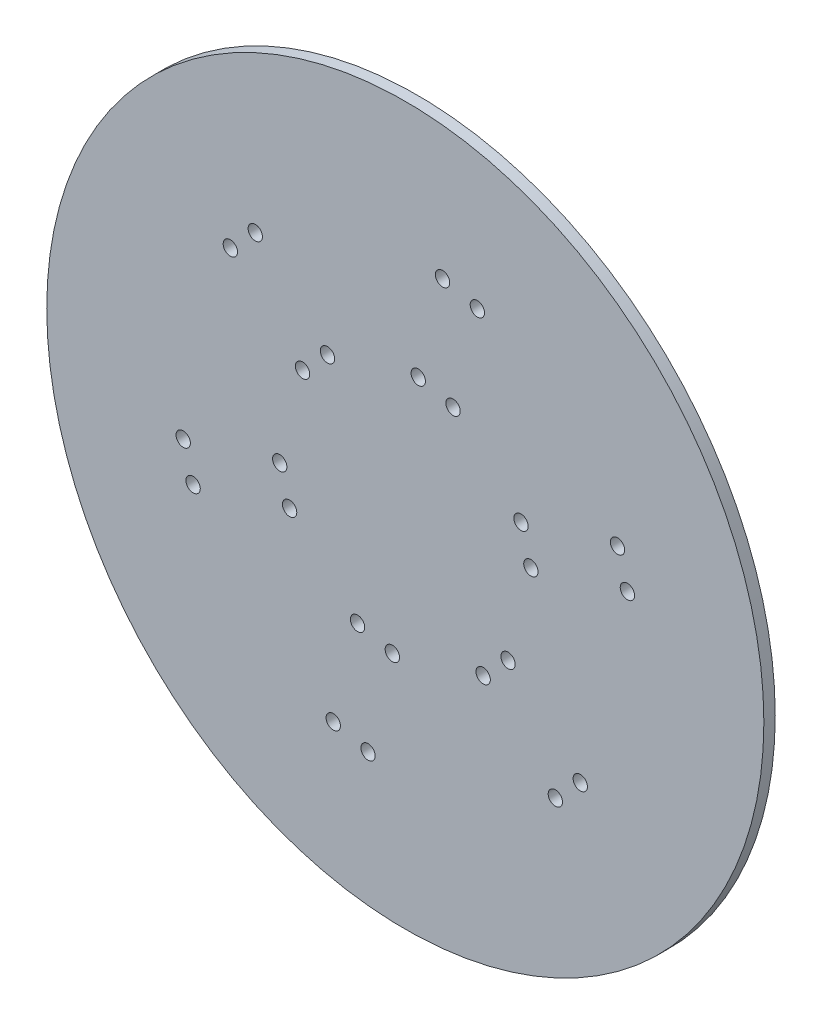
ISO-10303-21;
HEADER;
FILE_DESCRIPTION(('STEP AP214'),'2;1');
FILE_NAME('part.step','',(''),(''),'','','');
FILE_SCHEMA(('AUTOMOTIVE_DESIGN { 1 0 10303 214 1 1 1 1 }'));
ENDSEC;
DATA;
#1=APPLICATION_CONTEXT('core data for automotive mechanical design processes');
#2=APPLICATION_PROTOCOL_DEFINITION('international standard','automotive_design',2000,#1);
#3=PRODUCT_CONTEXT('',#1,'mechanical');
#4=PRODUCT('Part','Part','',(#3));
#5=PRODUCT_RELATED_PRODUCT_CATEGORY('part','',(#4));
#6=PRODUCT_DEFINITION_FORMATION('','',#4);
#7=PRODUCT_DEFINITION_CONTEXT('part definition',#1,'design');
#8=PRODUCT_DEFINITION('design','',#6,#7);
#9=PRODUCT_DEFINITION_SHAPE('','',#8);
#10=(LENGTH_UNIT() NAMED_UNIT(*) SI_UNIT(.MILLI.,.METRE.));
#11=(NAMED_UNIT(*) PLANE_ANGLE_UNIT() SI_UNIT($,.RADIAN.));
#12=(NAMED_UNIT(*) SI_UNIT($,.STERADIAN.) SOLID_ANGLE_UNIT());
#13=UNCERTAINTY_MEASURE_WITH_UNIT(LENGTH_MEASURE(1.E-05),#10,'distance_accuracy_value','');
#14=(GEOMETRIC_REPRESENTATION_CONTEXT(3) GLOBAL_UNCERTAINTY_ASSIGNED_CONTEXT((#13)) GLOBAL_UNIT_ASSIGNED_CONTEXT((#10,
#11,#12)) REPRESENTATION_CONTEXT('',''));
#15=CARTESIAN_POINT('',(0.,0.,0.));
#16=DIRECTION('',(0.,0.,1.));
#17=DIRECTION('',(1.,0.,0.));
#18=AXIS2_PLACEMENT_3D('',#15,#16,#17);
#19=CARTESIAN_POINT('',(0.,0.,3.175));
#20=DIRECTION('',(0.,0.,-1.));
#21=DIRECTION('',(-1.,0.,0.));
#22=AXIS2_PLACEMENT_3D('',#19,#20,#21);
#23=CYLINDRICAL_SURFACE('',#22,100.);
#24=CARTESIAN_POINT('',(0.,0.,3.175));
#25=DIRECTION('',(0.,0.,1.));
#26=DIRECTION('',(1.,0.,0.));
#27=AXIS2_PLACEMENT_3D('',#24,#25,#26);
#28=CIRCLE('',#27,100.);
#29=CARTESIAN_POINT('',(100.,0.,3.175));
#30=VERTEX_POINT('',#29);
#31=EDGE_CURVE('E10',#30,#30,#28,.T.);
#32=ORIENTED_EDGE('',*,*,#31,.F.);
#33=EDGE_LOOP('',(#32));
#34=FACE_BOUND('',#33,.T.);
#35=CARTESIAN_POINT('',(0.,0.,0.));
#36=DIRECTION('',(0.,0.,1.));
#37=DIRECTION('',(1.,0.,0.));
#38=AXIS2_PLACEMENT_3D('',#35,#36,#37);
#39=CIRCLE('',#38,100.);
#40=CARTESIAN_POINT('',(100.,0.,0.));
#41=VERTEX_POINT('',#40);
#42=EDGE_CURVE('E52',#41,#41,#39,.T.);
#43=ORIENTED_EDGE('',*,*,#42,.T.);
#44=EDGE_LOOP('',(#43));
#45=FACE_BOUND('',#44,.T.);
#46=ADVANCED_FACE('F49',(#34,#45),#23,.T.);
#47=CARTESIAN_POINT('',(0.,0.,3.175));
#48=DIRECTION('',(0.,0.,1.));
#49=DIRECTION('',(1.,0.,0.));
#50=AXIS2_PLACEMENT_3D('',#47,#48,#49);
#51=PLANE('',#50);
#52=CARTESIAN_POINT('',(-3.61521008648678,-35.1700192782212,3.175));
#53=DIRECTION('',(0.,0.,1.));
#54=DIRECTION('',(1.,0.,0.));
#55=AXIS2_PLACEMENT_3D('',#52,#53,#54);
#56=CIRCLE('',#55,2.);
#57=CARTESIAN_POINT('',(-1.61521008648678,-35.1700192782212,3.175));
#58=VERTEX_POINT('',#57);
#59=EDGE_CURVE('E135',#58,#58,#56,.T.);
#60=ORIENTED_EDGE('',*,*,#59,.F.);
#61=EDGE_LOOP('',(#60));
#62=FACE_BOUND('',#61,.T.);
#63=CARTESIAN_POINT('',(-59.1809359153441,-22.1724338804686,3.175));
#64=DIRECTION('',(0.,0.,1.));
#65=DIRECTION('',(1.,0.,0.));
#66=AXIS2_PLACEMENT_3D('',#63,#64,#65);
#67=CIRCLE('',#66,2.);
#68=CARTESIAN_POINT('',(-57.1809359153441,-22.1724338804686,3.175));
#69=VERTEX_POINT('',#68);
#70=EDGE_CURVE('E144',#69,#69,#67,.T.);
#71=ORIENTED_EDGE('',*,*,#70,.F.);
#72=EDGE_LOOP('',(#71));
#73=FACE_BOUND('',#72,.T.);
#74=CARTESIAN_POINT('',(-61.9374673497274,-12.5598621927642,3.175));
#75=DIRECTION('',(0.,0.,1.));
#76=DIRECTION('',(1.,0.,0.));
#77=AXIS2_PLACEMENT_3D('',#74,#75,#76);
#78=CIRCLE('',#77,2.);
#79=CARTESIAN_POINT('',(-59.9374673497274,-12.5598621927642,3.175));
#80=VERTEX_POINT('',#79);
#81=EDGE_CURVE('E152',#80,#80,#78,.T.);
#82=ORIENTED_EDGE('',*,*,#81,.F.);
#83=EDGE_LOOP('',(#82));
#84=FACE_BOUND('',#83,.T.);
#85=CARTESIAN_POINT('',(-32.2657351897717,-14.4541458641952,3.175));
#86=DIRECTION('',(0.,0.,1.));
#87=DIRECTION('',(1.,0.,0.));
#88=AXIS2_PLACEMENT_3D('',#85,#86,#87);
#89=CIRCLE('',#88,2.);
#90=CARTESIAN_POINT('',(-30.2657351897717,-14.4541458641952,3.175));
#91=VERTEX_POINT('',#90);
#92=EDGE_CURVE('E160',#91,#91,#89,.T.);
#93=ORIENTED_EDGE('',*,*,#92,.F.);
#94=EDGE_LOOP('',(#93));
#95=FACE_BOUND('',#94,.T.);
#96=CARTESIAN_POINT('',(-28.650525103285,20.7158734140257,3.175));
#97=DIRECTION('',(0.,0.,1.));
#98=DIRECTION('',(1.,0.,0.));
#99=AXIS2_PLACEMENT_3D('',#96,#97,#98);
#100=CIRCLE('',#99,2.);
#101=CARTESIAN_POINT('',(-26.650525103285,20.7158734140257,3.175));
#102=VERTEX_POINT('',#101);
#103=EDGE_CURVE('E178',#102,#102,#100,.T.);
#104=ORIENTED_EDGE('',*,*,#103,.F.);
#105=EDGE_LOOP('',(#104));
#106=FACE_BOUND('',#105,.T.);
#107=CARTESIAN_POINT('',(-41.8458934018298,47.3594890745504,3.175));
#108=DIRECTION('',(0.,0.,1.));
#109=DIRECTION('',(1.,0.,0.));
#110=AXIS2_PLACEMENT_3D('',#107,#108,#109);
#111=CIRCLE('',#110,2.);
#112=CARTESIAN_POINT('',(-39.8458934018298,47.3594890745504,3.175));
#113=VERTEX_POINT('',#112);
#114=EDGE_CURVE('E169',#113,#113,#111,.T.);
#115=ORIENTED_EDGE('',*,*,#114,.F.);
#116=EDGE_LOOP('',(#115));
#117=FACE_BOUND('',#116,.T.);
#118=CARTESIAN_POINT('',(-48.7923589618892,40.1659769821918,3.175));
#119=DIRECTION('',(0.,0.,1.));
#120=DIRECTION('',(1.,0.,0.));
#121=AXIS2_PLACEMENT_3D('',#118,#119,#120);
#122=CIRCLE('',#121,2.);
#123=CARTESIAN_POINT('',(-46.7923589618892,40.1659769821918,3.175));
#124=VERTEX_POINT('',#123);
#125=EDGE_CURVE('E192',#124,#124,#122,.T.);
#126=ORIENTED_EDGE('',*,*,#125,.F.);
#127=EDGE_LOOP('',(#126));
#128=FACE_BOUND('',#127,.T.);
#129=CARTESIAN_POINT('',(-35.022266624155,-4.8415741764908,3.175));
#130=DIRECTION('',(0.,0.,1.));
#131=DIRECTION('',(1.,0.,0.));
#132=AXIS2_PLACEMENT_3D('',#129,#130,#131);
#133=CIRCLE('',#132,2.);
#134=CARTESIAN_POINT('',(-33.022266624155,-4.8415741764908,3.175));
#135=VERTEX_POINT('',#134);
#136=EDGE_CURVE('E168',#135,#135,#133,.T.);
#137=ORIENTED_EDGE('',*,*,#136,.F.);
#138=EDGE_LOOP('',(#137));
#139=FACE_BOUND('',#138,.T.);
#140=CARTESIAN_POINT('',(13.3182070809293,32.7509596828753,3.175));
#141=DIRECTION('',(0.,0.,1.));
#142=DIRECTION('',(1.,0.,0.));
#143=AXIS2_PLACEMENT_3D('',#140,#141,#142);
#144=CIRCLE('',#143,2.);
#145=CARTESIAN_POINT('',(15.3182070809293,32.7509596828753,3.175));
#146=VERTEX_POINT('',#145);
#147=EDGE_CURVE('E87',#146,#146,#144,.T.);
#148=ORIENTED_EDGE('',*,*,#147,.F.);
#149=EDGE_LOOP('',(#148));
#150=FACE_BOUND('',#149,.T.);
#151=CARTESIAN_POINT('',(32.2657351897721,14.4541458641959,3.175));
#152=DIRECTION('',(0.,0.,1.));
#153=DIRECTION('',(1.,0.,0.));
#154=AXIS2_PLACEMENT_3D('',#151,#152,#153);
#155=CIRCLE('',#154,2.);
#156=CARTESIAN_POINT('',(34.2657351897721,14.4541458641959,3.175));
#157=VERTEX_POINT('',#156);
#158=EDGE_CURVE('E96',#157,#157,#155,.T.);
#159=ORIENTED_EDGE('',*,*,#158,.F.);
#160=EDGE_LOOP('',(#159));
#161=FACE_BOUND('',#160,.T.);
#162=CARTESIAN_POINT('',(35.0222666241555,4.84157417649146,3.175));
#163=DIRECTION('',(0.,0.,1.));
#164=DIRECTION('',(1.,0.,0.));
#165=AXIS2_PLACEMENT_3D('',#162,#163,#164);
#166=CIRCLE('',#165,2.);
#167=CARTESIAN_POINT('',(37.0222666241555,4.84157417649146,3.175));
#168=VERTEX_POINT('',#167);
#169=EDGE_CURVE('E71',#168,#168,#166,.T.);
#170=ORIENTED_EDGE('',*,*,#169,.F.);
#171=EDGE_LOOP('',(#170));
#172=FACE_BOUND('',#171,.T.);
#173=CARTESIAN_POINT('',(59.1809359153444,22.1724338804694,3.175));
#174=DIRECTION('',(0.,0.,1.));
#175=DIRECTION('',(1.,0.,0.));
#176=AXIS2_PLACEMENT_3D('',#173,#174,#175);
#177=CIRCLE('',#176,2.);
#178=CARTESIAN_POINT('',(61.1809359153444,22.1724338804694,3.175));
#179=VERTEX_POINT('',#178);
#180=EDGE_CURVE('E80',#179,#179,#177,.T.);
#181=ORIENTED_EDGE('',*,*,#180,.F.);
#182=EDGE_LOOP('',(#181));
#183=FACE_BOUND('',#182,.T.);
#184=CARTESIAN_POINT('',(-21.7040595432257,27.9093855063843,3.175));
#185=DIRECTION('',(0.,0.,1.));
#186=DIRECTION('',(1.,0.,0.));
#187=AXIS2_PLACEMENT_3D('',#184,#185,#186);
#188=CIRCLE('',#187,2.);
#189=CARTESIAN_POINT('',(-19.7040595432257,27.9093855063843,3.175));
#190=VERTEX_POINT('',#189);
#191=EDGE_CURVE('E119',#190,#190,#188,.T.);
#192=ORIENTED_EDGE('',*,*,#191,.F.);
#193=EDGE_LOOP('',(#192));
#194=FACE_BOUND('',#193,.T.);
#195=CARTESIAN_POINT('',(10.3885769534548,62.3384108626608,3.175));
#196=DIRECTION('',(0.,0.,1.));
#197=DIRECTION('',(1.,0.,0.));
#198=AXIS2_PLACEMENT_3D('',#195,#196,#197);
#199=CIRCLE('',#198,2.);
#200=CARTESIAN_POINT('',(12.3885769534548,62.3384108626608,3.175));
#201=VERTEX_POINT('',#200);
#202=EDGE_CURVE('E128',#201,#201,#199,.T.);
#203=ORIENTED_EDGE('',*,*,#202,.F.);
#204=EDGE_LOOP('',(#203));
#205=FACE_BOUND('',#204,.T.);
#206=CARTESIAN_POINT('',(20.0915739478976,59.9193512673151,3.175));
#207=DIRECTION('',(0.,0.,1.));
#208=DIRECTION('',(1.,0.,0.));
#209=AXIS2_PLACEMENT_3D('',#206,#207,#208);
#210=CIRCLE('',#209,2.);
#211=CARTESIAN_POINT('',(22.0915739478976,59.9193512673151,3.175));
#212=VERTEX_POINT('',#211);
#213=EDGE_CURVE('E103',#212,#212,#210,.T.);
#214=ORIENTED_EDGE('',*,*,#213,.F.);
#215=EDGE_LOOP('',(#214));
#216=FACE_BOUND('',#215,.T.);
#217=CARTESIAN_POINT('',(3.61521008648658,35.1700192782211,3.175));
#218=DIRECTION('',(0.,0.,1.));
#219=DIRECTION('',(1.,0.,0.));
#220=AXIS2_PLACEMENT_3D('',#217,#218,#219);
#221=CIRCLE('',#220,2.);
#222=CARTESIAN_POINT('',(5.61521008648658,35.1700192782211,3.175));
#223=VERTEX_POINT('',#222);
#224=EDGE_CURVE('E112',#223,#223,#221,.T.);
#225=ORIENTED_EDGE('',*,*,#224,.F.);
#226=EDGE_LOOP('',(#225));
#227=FACE_BOUND('',#226,.T.);
#228=CARTESIAN_POINT('',(21.706133595428,-27.8768285363425,3.175));
#229=DIRECTION('',(0.,0.,1.));
#230=DIRECTION('',(1.,0.,0.));
#231=AXIS2_PLACEMENT_3D('',#228,#229,#230);
#232=CIRCLE('',#231,2.);
#233=CARTESIAN_POINT('',(23.706133595428,-27.8768285363425,3.175));
#234=VERTEX_POINT('',#233);
#235=EDGE_CURVE('E231',#234,#234,#232,.T.);
#236=ORIENTED_EDGE('',*,*,#235,.F.);
#237=EDGE_LOOP('',(#236));
#238=FACE_BOUND('',#237,.T.);
#239=CARTESIAN_POINT('',(41.8458934018295,-47.3594890745508,3.175));
#240=DIRECTION('',(0.,0.,1.));
#241=DIRECTION('',(1.,0.,0.));
#242=AXIS2_PLACEMENT_3D('',#239,#240,#241);
#243=CIRCLE('',#242,2.);
#244=CARTESIAN_POINT('',(43.8458934018295,-47.3594890745508,3.175));
#245=VERTEX_POINT('',#244);
#246=EDGE_CURVE('E239',#245,#245,#243,.T.);
#247=ORIENTED_EDGE('',*,*,#246,.F.);
#248=EDGE_LOOP('',(#247));
#249=FACE_BOUND('',#248,.T.);
#250=CARTESIAN_POINT('',(48.7923589618889,-40.1659769821923,3.175));
#251=DIRECTION('',(0.,0.,1.));
#252=DIRECTION('',(1.,0.,0.));
#253=AXIS2_PLACEMENT_3D('',#250,#251,#252);
#254=CIRCLE('',#253,2.);
#255=CARTESIAN_POINT('',(50.7923589618889,-40.1659769821923,3.175));
#256=VERTEX_POINT('',#255);
#257=EDGE_CURVE('E247',#256,#256,#254,.T.);
#258=ORIENTED_EDGE('',*,*,#257,.F.);
#259=EDGE_LOOP('',(#258));
#260=FACE_BOUND('',#259,.T.);
#261=CARTESIAN_POINT('',(-13.3182070809295,-32.7509596828754,3.175));
#262=DIRECTION('',(0.,0.,1.));
#263=DIRECTION('',(1.,0.,0.));
#264=AXIS2_PLACEMENT_3D('',#261,#262,#263);
#265=CIRCLE('',#264,2.);
#266=CARTESIAN_POINT('',(-11.3182070809295,-32.7509596828754,3.175));
#267=VERTEX_POINT('',#266);
#268=EDGE_CURVE('E208',#267,#267,#265,.T.);
#269=ORIENTED_EDGE('',*,*,#268,.F.);
#270=EDGE_LOOP('',(#269));
#271=FACE_BOUND('',#270,.T.);
#272=CARTESIAN_POINT('',(-10.3885769534552,-62.3384108626609,3.175));
#273=DIRECTION('',(0.,0.,1.));
#274=DIRECTION('',(1.,0.,0.));
#275=AXIS2_PLACEMENT_3D('',#272,#273,#274);
#276=CIRCLE('',#275,2.);
#277=CARTESIAN_POINT('',(-8.38857695345518,-62.3384108626609,3.175));
#278=VERTEX_POINT('',#277);
#279=EDGE_CURVE('E199',#278,#278,#276,.T.);
#280=ORIENTED_EDGE('',*,*,#279,.F.);
#281=EDGE_LOOP('',(#280));
#282=FACE_BOUND('',#281,.T.);
#283=CARTESIAN_POINT('',(-20.0915739478979,-59.9193512673151,3.175));
#284=DIRECTION('',(0.,0.,1.));
#285=DIRECTION('',(1.,0.,0.));
#286=AXIS2_PLACEMENT_3D('',#283,#284,#285);
#287=CIRCLE('',#286,2.);
#288=CARTESIAN_POINT('',(-18.0915739478979,-59.9193512673151,3.175));
#289=VERTEX_POINT('',#288);
#290=EDGE_CURVE('E224',#289,#289,#287,.T.);
#291=ORIENTED_EDGE('',*,*,#290,.F.);
#292=EDGE_LOOP('',(#291));
#293=FACE_BOUND('',#292,.T.);
#294=CARTESIAN_POINT('',(28.6505251032849,-20.715873414026,3.175));
#295=DIRECTION('',(0.,0.,1.));
#296=DIRECTION('',(1.,0.,0.));
#297=AXIS2_PLACEMENT_3D('',#294,#295,#296);
#298=CIRCLE('',#297,2.);
#299=CARTESIAN_POINT('',(30.6505251032849,-20.715873414026,3.175));
#300=VERTEX_POINT('',#299);
#301=EDGE_CURVE('E215',#300,#300,#298,.T.);
#302=ORIENTED_EDGE('',*,*,#301,.F.);
#303=EDGE_LOOP('',(#302));
#304=FACE_BOUND('',#303,.T.);
#305=CARTESIAN_POINT('',(61.9374673497278,12.559862192765,3.175));
#306=DIRECTION('',(0.,0.,1.));
#307=DIRECTION('',(1.,0.,0.));
#308=AXIS2_PLACEMENT_3D('',#305,#306,#307);
#309=CIRCLE('',#308,2.);
#310=CARTESIAN_POINT('',(63.9374673497278,12.559862192765,3.175));
#311=VERTEX_POINT('',#310);
#312=EDGE_CURVE('E63',#311,#311,#309,.T.);
#313=ORIENTED_EDGE('',*,*,#312,.F.);
#314=EDGE_LOOP('',(#313));
#315=FACE_BOUND('',#314,.T.);
#316=ORIENTED_EDGE('',*,*,#31,.T.);
#317=EDGE_LOOP('',(#316));
#318=FACE_BOUND('',#317,.T.);
#319=ADVANCED_FACE('F266',(#62,#73,#84,#95,#106,#117,#128,#139,#150,#161,#172,#183,#194,#205,
#216,#227,#238,#249,#260,#271,#282,#293,#304,#315,#318),#51,.T.);
#320=CARTESIAN_POINT('',(0.,0.,0.));
#321=DIRECTION('',(0.,0.,1.));
#322=DIRECTION('',(1.,0.,0.));
#323=AXIS2_PLACEMENT_3D('',#320,#321,#322);
#324=PLANE('',#323);
#325=CARTESIAN_POINT('',(-3.61521008648678,-35.1700192782212,0.));
#326=DIRECTION('',(0.,0.,1.));
#327=DIRECTION('',(1.,0.,0.));
#328=AXIS2_PLACEMENT_3D('',#325,#326,#327);
#329=CIRCLE('',#328,2.);
#330=CARTESIAN_POINT('',(-1.61521008648678,-35.1700192782212,0.));
#331=VERTEX_POINT('',#330);
#332=EDGE_CURVE('E139',#331,#331,#329,.T.);
#333=ORIENTED_EDGE('',*,*,#332,.T.);
#334=EDGE_LOOP('',(#333));
#335=FACE_BOUND('',#334,.T.);
#336=CARTESIAN_POINT('',(-59.1809359153441,-22.1724338804686,0.));
#337=DIRECTION('',(0.,0.,1.));
#338=DIRECTION('',(1.,0.,0.));
#339=AXIS2_PLACEMENT_3D('',#336,#337,#338);
#340=CIRCLE('',#339,2.);
#341=CARTESIAN_POINT('',(-57.1809359153441,-22.1724338804686,0.));
#342=VERTEX_POINT('',#341);
#343=EDGE_CURVE('E148',#342,#342,#340,.T.);
#344=ORIENTED_EDGE('',*,*,#343,.T.);
#345=EDGE_LOOP('',(#344));
#346=FACE_BOUND('',#345,.T.);
#347=CARTESIAN_POINT('',(-61.9374673497274,-12.5598621927642,0.));
#348=DIRECTION('',(0.,0.,1.));
#349=DIRECTION('',(1.,0.,0.));
#350=AXIS2_PLACEMENT_3D('',#347,#348,#349);
#351=CIRCLE('',#350,2.);
#352=CARTESIAN_POINT('',(-59.9374673497274,-12.5598621927642,0.));
#353=VERTEX_POINT('',#352);
#354=EDGE_CURVE('E156',#353,#353,#351,.T.);
#355=ORIENTED_EDGE('',*,*,#354,.T.);
#356=EDGE_LOOP('',(#355));
#357=FACE_BOUND('',#356,.T.);
#358=CARTESIAN_POINT('',(-32.2657351897717,-14.4541458641952,0.));
#359=DIRECTION('',(0.,0.,1.));
#360=DIRECTION('',(1.,0.,0.));
#361=AXIS2_PLACEMENT_3D('',#358,#359,#360);
#362=CIRCLE('',#361,2.);
#363=CARTESIAN_POINT('',(-30.2657351897717,-14.4541458641952,0.));
#364=VERTEX_POINT('',#363);
#365=EDGE_CURVE('E164',#364,#364,#362,.T.);
#366=ORIENTED_EDGE('',*,*,#365,.T.);
#367=EDGE_LOOP('',(#366));
#368=FACE_BOUND('',#367,.T.);
#369=CARTESIAN_POINT('',(-28.650525103285,20.7158734140257,0.));
#370=DIRECTION('',(0.,0.,1.));
#371=DIRECTION('',(1.,0.,0.));
#372=AXIS2_PLACEMENT_3D('',#369,#370,#371);
#373=CIRCLE('',#372,2.);
#374=CARTESIAN_POINT('',(-26.650525103285,20.7158734140257,0.));
#375=VERTEX_POINT('',#374);
#376=EDGE_CURVE('E124',#375,#375,#373,.T.);
#377=ORIENTED_EDGE('',*,*,#376,.T.);
#378=EDGE_LOOP('',(#377));
#379=FACE_BOUND('',#378,.T.);
#380=CARTESIAN_POINT('',(-41.8458934018298,47.3594890745504,0.));
#381=DIRECTION('',(0.,0.,1.));
#382=DIRECTION('',(1.,0.,0.));
#383=AXIS2_PLACEMENT_3D('',#380,#381,#382);
#384=CIRCLE('',#383,2.);
#385=CARTESIAN_POINT('',(-39.8458934018298,47.3594890745504,0.));
#386=VERTEX_POINT('',#385);
#387=EDGE_CURVE('E173',#386,#386,#384,.T.);
#388=ORIENTED_EDGE('',*,*,#387,.T.);
#389=EDGE_LOOP('',(#388));
#390=FACE_BOUND('',#389,.T.);
#391=CARTESIAN_POINT('',(-48.7923589618892,40.1659769821918,0.));
#392=DIRECTION('',(0.,0.,1.));
#393=DIRECTION('',(1.,0.,0.));
#394=AXIS2_PLACEMENT_3D('',#391,#392,#393);
#395=CIRCLE('',#394,2.);
#396=CARTESIAN_POINT('',(-46.7923589618892,40.1659769821918,0.));
#397=VERTEX_POINT('',#396);
#398=EDGE_CURVE('E174',#397,#397,#395,.T.);
#399=ORIENTED_EDGE('',*,*,#398,.T.);
#400=EDGE_LOOP('',(#399));
#401=FACE_BOUND('',#400,.T.);
#402=CARTESIAN_POINT('',(-35.022266624155,-4.8415741764908,0.));
#403=DIRECTION('',(0.,0.,1.));
#404=DIRECTION('',(1.,0.,0.));
#405=AXIS2_PLACEMENT_3D('',#402,#403,#404);
#406=CIRCLE('',#405,2.);
#407=CARTESIAN_POINT('',(-33.022266624155,-4.8415741764908,0.));
#408=VERTEX_POINT('',#407);
#409=EDGE_CURVE('E188',#408,#408,#406,.T.);
#410=ORIENTED_EDGE('',*,*,#409,.T.);
#411=EDGE_LOOP('',(#410));
#412=FACE_BOUND('',#411,.T.);
#413=CARTESIAN_POINT('',(13.3182070809293,32.7509596828753,0.));
#414=DIRECTION('',(0.,0.,1.));
#415=DIRECTION('',(1.,0.,0.));
#416=AXIS2_PLACEMENT_3D('',#413,#414,#415);
#417=CIRCLE('',#416,2.);
#418=CARTESIAN_POINT('',(15.3182070809293,32.7509596828753,0.));
#419=VERTEX_POINT('',#418);
#420=EDGE_CURVE('E91',#419,#419,#417,.T.);
#421=ORIENTED_EDGE('',*,*,#420,.T.);
#422=EDGE_LOOP('',(#421));
#423=FACE_BOUND('',#422,.T.);
#424=CARTESIAN_POINT('',(32.2657351897721,14.4541458641959,0.));
#425=DIRECTION('',(0.,0.,1.));
#426=DIRECTION('',(1.,0.,0.));
#427=AXIS2_PLACEMENT_3D('',#424,#425,#426);
#428=CIRCLE('',#427,2.);
#429=CARTESIAN_POINT('',(34.2657351897721,14.4541458641959,0.));
#430=VERTEX_POINT('',#429);
#431=EDGE_CURVE('E76',#430,#430,#428,.T.);
#432=ORIENTED_EDGE('',*,*,#431,.T.);
#433=EDGE_LOOP('',(#432));
#434=FACE_BOUND('',#433,.T.);
#435=CARTESIAN_POINT('',(35.0222666241555,4.84157417649146,0.));
#436=DIRECTION('',(0.,0.,1.));
#437=DIRECTION('',(1.,0.,0.));
#438=AXIS2_PLACEMENT_3D('',#435,#436,#437);
#439=CIRCLE('',#438,2.);
#440=CARTESIAN_POINT('',(37.0222666241555,4.84157417649146,0.));
#441=VERTEX_POINT('',#440);
#442=EDGE_CURVE('E75',#441,#441,#439,.T.);
#443=ORIENTED_EDGE('',*,*,#442,.T.);
#444=EDGE_LOOP('',(#443));
#445=FACE_BOUND('',#444,.T.);
#446=CARTESIAN_POINT('',(59.1809359153444,22.1724338804694,0.));
#447=DIRECTION('',(0.,0.,1.));
#448=DIRECTION('',(1.,0.,0.));
#449=AXIS2_PLACEMENT_3D('',#446,#447,#448);
#450=CIRCLE('',#449,2.);
#451=CARTESIAN_POINT('',(61.1809359153444,22.1724338804694,0.));
#452=VERTEX_POINT('',#451);
#453=EDGE_CURVE('E67',#452,#452,#450,.T.);
#454=ORIENTED_EDGE('',*,*,#453,.T.);
#455=EDGE_LOOP('',(#454));
#456=FACE_BOUND('',#455,.T.);
#457=CARTESIAN_POINT('',(-21.7040595432257,27.9093855063843,0.));
#458=DIRECTION('',(0.,0.,1.));
#459=DIRECTION('',(1.,0.,0.));
#460=AXIS2_PLACEMENT_3D('',#457,#458,#459);
#461=CIRCLE('',#460,2.);
#462=CARTESIAN_POINT('',(-19.7040595432257,27.9093855063843,0.));
#463=VERTEX_POINT('',#462);
#464=EDGE_CURVE('E123',#463,#463,#461,.T.);
#465=ORIENTED_EDGE('',*,*,#464,.T.);
#466=EDGE_LOOP('',(#465));
#467=FACE_BOUND('',#466,.T.);
#468=CARTESIAN_POINT('',(10.3885769534548,62.3384108626608,0.));
#469=DIRECTION('',(0.,0.,1.));
#470=DIRECTION('',(1.,0.,0.));
#471=AXIS2_PLACEMENT_3D('',#468,#469,#470);
#472=CIRCLE('',#471,2.);
#473=CARTESIAN_POINT('',(12.3885769534548,62.3384108626608,0.));
#474=VERTEX_POINT('',#473);
#475=EDGE_CURVE('E108',#474,#474,#472,.T.);
#476=ORIENTED_EDGE('',*,*,#475,.T.);
#477=EDGE_LOOP('',(#476));
#478=FACE_BOUND('',#477,.T.);
#479=CARTESIAN_POINT('',(20.0915739478976,59.9193512673151,0.));
#480=DIRECTION('',(0.,0.,1.));
#481=DIRECTION('',(1.,0.,0.));
#482=AXIS2_PLACEMENT_3D('',#479,#480,#481);
#483=CIRCLE('',#482,2.);
#484=CARTESIAN_POINT('',(22.0915739478976,59.9193512673151,0.));
#485=VERTEX_POINT('',#484);
#486=EDGE_CURVE('E107',#485,#485,#483,.T.);
#487=ORIENTED_EDGE('',*,*,#486,.T.);
#488=EDGE_LOOP('',(#487));
#489=FACE_BOUND('',#488,.T.);
#490=CARTESIAN_POINT('',(3.61521008648658,35.1700192782211,0.));
#491=DIRECTION('',(0.,0.,1.));
#492=DIRECTION('',(1.,0.,0.));
#493=AXIS2_PLACEMENT_3D('',#490,#491,#492);
#494=CIRCLE('',#493,2.);
#495=CARTESIAN_POINT('',(5.61521008648658,35.1700192782211,0.));
#496=VERTEX_POINT('',#495);
#497=EDGE_CURVE('E92',#496,#496,#494,.T.);
#498=ORIENTED_EDGE('',*,*,#497,.T.);
#499=EDGE_LOOP('',(#498));
#500=FACE_BOUND('',#499,.T.);
#501=CARTESIAN_POINT('',(21.706133595428,-27.8768285363425,0.));
#502=DIRECTION('',(0.,0.,1.));
#503=DIRECTION('',(1.,0.,0.));
#504=AXIS2_PLACEMENT_3D('',#501,#502,#503);
#505=CIRCLE('',#504,2.);
#506=CARTESIAN_POINT('',(23.706133595428,-27.8768285363425,0.));
#507=VERTEX_POINT('',#506);
#508=EDGE_CURVE('E235',#507,#507,#505,.T.);
#509=ORIENTED_EDGE('',*,*,#508,.T.);
#510=EDGE_LOOP('',(#509));
#511=FACE_BOUND('',#510,.T.);
#512=CARTESIAN_POINT('',(41.8458934018295,-47.3594890745508,0.));
#513=DIRECTION('',(0.,0.,1.));
#514=DIRECTION('',(1.,0.,0.));
#515=AXIS2_PLACEMENT_3D('',#512,#513,#514);
#516=CIRCLE('',#515,2.);
#517=CARTESIAN_POINT('',(43.8458934018295,-47.3594890745508,0.));
#518=VERTEX_POINT('',#517);
#519=EDGE_CURVE('E243',#518,#518,#516,.T.);
#520=ORIENTED_EDGE('',*,*,#519,.T.);
#521=EDGE_LOOP('',(#520));
#522=FACE_BOUND('',#521,.T.);
#523=CARTESIAN_POINT('',(48.7923589618889,-40.1659769821923,0.));
#524=DIRECTION('',(0.,0.,1.));
#525=DIRECTION('',(1.,0.,0.));
#526=AXIS2_PLACEMENT_3D('',#523,#524,#525);
#527=CIRCLE('',#526,2.);
#528=CARTESIAN_POINT('',(50.7923589618889,-40.1659769821923,0.));
#529=VERTEX_POINT('',#528);
#530=EDGE_CURVE('E220',#529,#529,#527,.T.);
#531=ORIENTED_EDGE('',*,*,#530,.T.);
#532=EDGE_LOOP('',(#531));
#533=FACE_BOUND('',#532,.T.);
#534=CARTESIAN_POINT('',(-13.3182070809295,-32.7509596828754,0.));
#535=DIRECTION('',(0.,0.,1.));
#536=DIRECTION('',(1.,0.,0.));
#537=AXIS2_PLACEMENT_3D('',#534,#535,#536);
#538=CIRCLE('',#537,2.);
#539=CARTESIAN_POINT('',(-11.3182070809295,-32.7509596828754,0.));
#540=VERTEX_POINT('',#539);
#541=EDGE_CURVE('E140',#540,#540,#538,.T.);
#542=ORIENTED_EDGE('',*,*,#541,.T.);
#543=EDGE_LOOP('',(#542));
#544=FACE_BOUND('',#543,.T.);
#545=CARTESIAN_POINT('',(-10.3885769534552,-62.3384108626609,0.));
#546=DIRECTION('',(0.,0.,1.));
#547=DIRECTION('',(1.,0.,0.));
#548=AXIS2_PLACEMENT_3D('',#545,#546,#547);
#549=CIRCLE('',#548,2.);
#550=CARTESIAN_POINT('',(-8.38857695345518,-62.3384108626609,0.));
#551=VERTEX_POINT('',#550);
#552=EDGE_CURVE('E203',#551,#551,#549,.T.);
#553=ORIENTED_EDGE('',*,*,#552,.T.);
#554=EDGE_LOOP('',(#553));
#555=FACE_BOUND('',#554,.T.);
#556=CARTESIAN_POINT('',(-20.0915739478979,-59.9193512673151,0.));
#557=DIRECTION('',(0.,0.,1.));
#558=DIRECTION('',(1.,0.,0.));
#559=AXIS2_PLACEMENT_3D('',#556,#557,#558);
#560=CIRCLE('',#559,2.);
#561=CARTESIAN_POINT('',(-18.0915739478979,-59.9193512673151,0.));
#562=VERTEX_POINT('',#561);
#563=EDGE_CURVE('E204',#562,#562,#560,.T.);
#564=ORIENTED_EDGE('',*,*,#563,.T.);
#565=EDGE_LOOP('',(#564));
#566=FACE_BOUND('',#565,.T.);
#567=CARTESIAN_POINT('',(28.6505251032849,-20.715873414026,0.));
#568=DIRECTION('',(0.,0.,1.));
#569=DIRECTION('',(1.,0.,0.));
#570=AXIS2_PLACEMENT_3D('',#567,#568,#569);
#571=CIRCLE('',#570,2.);
#572=CARTESIAN_POINT('',(30.6505251032849,-20.715873414026,0.));
#573=VERTEX_POINT('',#572);
#574=EDGE_CURVE('E219',#573,#573,#571,.T.);
#575=ORIENTED_EDGE('',*,*,#574,.T.);
#576=EDGE_LOOP('',(#575));
#577=FACE_BOUND('',#576,.T.);
#578=CARTESIAN_POINT('',(61.9374673497278,12.559862192765,0.));
#579=DIRECTION('',(0.,0.,1.));
#580=DIRECTION('',(1.,0.,0.));
#581=AXIS2_PLACEMENT_3D('',#578,#579,#580);
#582=CIRCLE('',#581,2.);
#583=CARTESIAN_POINT('',(63.9374673497278,12.559862192765,0.));
#584=VERTEX_POINT('',#583);
#585=EDGE_CURVE('E61',#584,#584,#582,.T.);
#586=ORIENTED_EDGE('',*,*,#585,.T.);
#587=EDGE_LOOP('',(#586));
#588=FACE_BOUND('',#587,.T.);
#589=ORIENTED_EDGE('',*,*,#42,.F.);
#590=EDGE_LOOP('',(#589));
#591=FACE_BOUND('',#590,.T.);
#592=ADVANCED_FACE('F255',(#335,#346,#357,#368,#379,#390,#401,#412,#423,#434,#445,#456,#467,
#478,#489,#500,#511,#522,#533,#544,#555,#566,#577,#588,#591),#324,.F.);
#593=CARTESIAN_POINT('',(61.9374673497278,12.559862192765,0.));
#594=DIRECTION('',(0.,0.,1.));
#595=DIRECTION('',(1.,0.,0.));
#596=AXIS2_PLACEMENT_3D('',#593,#594,#595);
#597=CYLINDRICAL_SURFACE('',#596,2.);
#598=ORIENTED_EDGE('',*,*,#585,.F.);
#599=EDGE_LOOP('',(#598));
#600=FACE_BOUND('',#599,.T.);
#601=ORIENTED_EDGE('',*,*,#312,.T.);
#602=EDGE_LOOP('',(#601));
#603=FACE_BOUND('',#602,.T.);
#604=ADVANCED_FACE('F281',(#600,#603),#597,.F.);
#605=CARTESIAN_POINT('',(28.6505251032849,-20.715873414026,0.));
#606=DIRECTION('',(0.,0.,1.));
#607=DIRECTION('',(1.,0.,0.));
#608=AXIS2_PLACEMENT_3D('',#605,#606,#607);
#609=CYLINDRICAL_SURFACE('',#608,2.);
#610=ORIENTED_EDGE('',*,*,#574,.F.);
#611=EDGE_LOOP('',(#610));
#612=FACE_BOUND('',#611,.T.);
#613=ORIENTED_EDGE('',*,*,#301,.T.);
#614=EDGE_LOOP('',(#613));
#615=FACE_BOUND('',#614,.T.);
#616=ADVANCED_FACE('F283',(#612,#615),#609,.F.);
#617=CARTESIAN_POINT('',(-20.0915739478979,-59.9193512673151,0.));
#618=DIRECTION('',(0.,0.,1.));
#619=DIRECTION('',(1.,0.,0.));
#620=AXIS2_PLACEMENT_3D('',#617,#618,#619);
#621=CYLINDRICAL_SURFACE('',#620,2.);
#622=ORIENTED_EDGE('',*,*,#563,.F.);
#623=EDGE_LOOP('',(#622));
#624=FACE_BOUND('',#623,.T.);
#625=ORIENTED_EDGE('',*,*,#290,.T.);
#626=EDGE_LOOP('',(#625));
#627=FACE_BOUND('',#626,.T.);
#628=ADVANCED_FACE('F290',(#624,#627),#621,.F.);
#629=CARTESIAN_POINT('',(-10.3885769534552,-62.3384108626609,0.));
#630=DIRECTION('',(0.,0.,1.));
#631=DIRECTION('',(1.,0.,0.));
#632=AXIS2_PLACEMENT_3D('',#629,#630,#631);
#633=CYLINDRICAL_SURFACE('',#632,2.);
#634=ORIENTED_EDGE('',*,*,#552,.F.);
#635=EDGE_LOOP('',(#634));
#636=FACE_BOUND('',#635,.T.);
#637=ORIENTED_EDGE('',*,*,#279,.T.);
#638=EDGE_LOOP('',(#637));
#639=FACE_BOUND('',#638,.T.);
#640=ADVANCED_FACE('F339',(#636,#639),#633,.F.);
#641=CARTESIAN_POINT('',(-13.3182070809295,-32.7509596828754,0.));
#642=DIRECTION('',(0.,0.,1.));
#643=DIRECTION('',(1.,0.,0.));
#644=AXIS2_PLACEMENT_3D('',#641,#642,#643);
#645=CYLINDRICAL_SURFACE('',#644,2.);
#646=ORIENTED_EDGE('',*,*,#541,.F.);
#647=EDGE_LOOP('',(#646));
#648=FACE_BOUND('',#647,.T.);
#649=ORIENTED_EDGE('',*,*,#268,.T.);
#650=EDGE_LOOP('',(#649));
#651=FACE_BOUND('',#650,.T.);
#652=ADVANCED_FACE('F262',(#648,#651),#645,.F.);
#653=CARTESIAN_POINT('',(48.7923589618889,-40.1659769821923,0.));
#654=DIRECTION('',(0.,0.,1.));
#655=DIRECTION('',(1.,0.,0.));
#656=AXIS2_PLACEMENT_3D('',#653,#654,#655);
#657=CYLINDRICAL_SURFACE('',#656,2.);
#658=ORIENTED_EDGE('',*,*,#530,.F.);
#659=EDGE_LOOP('',(#658));
#660=FACE_BOUND('',#659,.T.);
#661=ORIENTED_EDGE('',*,*,#257,.T.);
#662=EDGE_LOOP('',(#661));
#663=FACE_BOUND('',#662,.T.);
#664=ADVANCED_FACE('F258',(#660,#663),#657,.F.);
#665=CARTESIAN_POINT('',(41.8458934018295,-47.3594890745508,0.));
#666=DIRECTION('',(0.,0.,1.));
#667=DIRECTION('',(1.,0.,0.));
#668=AXIS2_PLACEMENT_3D('',#665,#666,#667);
#669=CYLINDRICAL_SURFACE('',#668,2.);
#670=ORIENTED_EDGE('',*,*,#519,.F.);
#671=EDGE_LOOP('',(#670));
#672=FACE_BOUND('',#671,.T.);
#673=ORIENTED_EDGE('',*,*,#246,.T.);
#674=EDGE_LOOP('',(#673));
#675=FACE_BOUND('',#674,.T.);
#676=ADVANCED_FACE('F261',(#672,#675),#669,.F.);
#677=CARTESIAN_POINT('',(21.706133595428,-27.8768285363425,0.));
#678=DIRECTION('',(0.,0.,1.));
#679=DIRECTION('',(1.,0.,0.));
#680=AXIS2_PLACEMENT_3D('',#677,#678,#679);
#681=CYLINDRICAL_SURFACE('',#680,2.);
#682=ORIENTED_EDGE('',*,*,#508,.F.);
#683=EDGE_LOOP('',(#682));
#684=FACE_BOUND('',#683,.T.);
#685=ORIENTED_EDGE('',*,*,#235,.T.);
#686=EDGE_LOOP('',(#685));
#687=FACE_BOUND('',#686,.T.);
#688=ADVANCED_FACE('F373',(#684,#687),#681,.F.);
#689=CARTESIAN_POINT('',(3.61521008648658,35.1700192782211,0.));
#690=DIRECTION('',(0.,0.,1.));
#691=DIRECTION('',(1.,0.,0.));
#692=AXIS2_PLACEMENT_3D('',#689,#690,#691);
#693=CYLINDRICAL_SURFACE('',#692,2.);
#694=ORIENTED_EDGE('',*,*,#497,.F.);
#695=EDGE_LOOP('',(#694));
#696=FACE_BOUND('',#695,.T.);
#697=ORIENTED_EDGE('',*,*,#224,.T.);
#698=EDGE_LOOP('',(#697));
#699=FACE_BOUND('',#698,.T.);
#700=ADVANCED_FACE('F383',(#696,#699),#693,.F.);
#701=CARTESIAN_POINT('',(20.0915739478976,59.9193512673151,0.));
#702=DIRECTION('',(0.,0.,1.));
#703=DIRECTION('',(1.,0.,0.));
#704=AXIS2_PLACEMENT_3D('',#701,#702,#703);
#705=CYLINDRICAL_SURFACE('',#704,2.);
#706=ORIENTED_EDGE('',*,*,#486,.F.);
#707=EDGE_LOOP('',(#706));
#708=FACE_BOUND('',#707,.T.);
#709=ORIENTED_EDGE('',*,*,#213,.T.);
#710=EDGE_LOOP('',(#709));
#711=FACE_BOUND('',#710,.T.);
#712=ADVANCED_FACE('F393',(#708,#711),#705,.F.);
#713=CARTESIAN_POINT('',(10.3885769534548,62.3384108626608,0.));
#714=DIRECTION('',(0.,0.,1.));
#715=DIRECTION('',(1.,0.,0.));
#716=AXIS2_PLACEMENT_3D('',#713,#714,#715);
#717=CYLINDRICAL_SURFACE('',#716,2.);
#718=ORIENTED_EDGE('',*,*,#475,.F.);
#719=EDGE_LOOP('',(#718));
#720=FACE_BOUND('',#719,.T.);
#721=ORIENTED_EDGE('',*,*,#202,.T.);
#722=EDGE_LOOP('',(#721));
#723=FACE_BOUND('',#722,.T.);
#724=ADVANCED_FACE('F403',(#720,#723),#717,.F.);
#725=CARTESIAN_POINT('',(-21.7040595432257,27.9093855063843,0.));
#726=DIRECTION('',(0.,0.,1.));
#727=DIRECTION('',(1.,0.,0.));
#728=AXIS2_PLACEMENT_3D('',#725,#726,#727);
#729=CYLINDRICAL_SURFACE('',#728,2.);
#730=ORIENTED_EDGE('',*,*,#464,.F.);
#731=EDGE_LOOP('',(#730));
#732=FACE_BOUND('',#731,.T.);
#733=ORIENTED_EDGE('',*,*,#191,.T.);
#734=EDGE_LOOP('',(#733));
#735=FACE_BOUND('',#734,.T.);
#736=ADVANCED_FACE('F413',(#732,#735),#729,.F.);
#737=CARTESIAN_POINT('',(59.1809359153444,22.1724338804694,0.));
#738=DIRECTION('',(0.,0.,1.));
#739=DIRECTION('',(1.,0.,0.));
#740=AXIS2_PLACEMENT_3D('',#737,#738,#739);
#741=CYLINDRICAL_SURFACE('',#740,2.);
#742=ORIENTED_EDGE('',*,*,#453,.F.);
#743=EDGE_LOOP('',(#742));
#744=FACE_BOUND('',#743,.T.);
#745=ORIENTED_EDGE('',*,*,#180,.T.);
#746=EDGE_LOOP('',(#745));
#747=FACE_BOUND('',#746,.T.);
#748=ADVANCED_FACE('F423',(#744,#747),#741,.F.);
#749=CARTESIAN_POINT('',(35.0222666241555,4.84157417649146,0.));
#750=DIRECTION('',(0.,0.,1.));
#751=DIRECTION('',(1.,0.,0.));
#752=AXIS2_PLACEMENT_3D('',#749,#750,#751);
#753=CYLINDRICAL_SURFACE('',#752,2.);
#754=ORIENTED_EDGE('',*,*,#442,.F.);
#755=EDGE_LOOP('',(#754));
#756=FACE_BOUND('',#755,.T.);
#757=ORIENTED_EDGE('',*,*,#169,.T.);
#758=EDGE_LOOP('',(#757));
#759=FACE_BOUND('',#758,.T.);
#760=ADVANCED_FACE('F433',(#756,#759),#753,.F.);
#761=CARTESIAN_POINT('',(32.2657351897721,14.4541458641959,0.));
#762=DIRECTION('',(0.,0.,1.));
#763=DIRECTION('',(1.,0.,0.));
#764=AXIS2_PLACEMENT_3D('',#761,#762,#763);
#765=CYLINDRICAL_SURFACE('',#764,2.);
#766=ORIENTED_EDGE('',*,*,#431,.F.);
#767=EDGE_LOOP('',(#766));
#768=FACE_BOUND('',#767,.T.);
#769=ORIENTED_EDGE('',*,*,#158,.T.);
#770=EDGE_LOOP('',(#769));
#771=FACE_BOUND('',#770,.T.);
#772=ADVANCED_FACE('F443',(#768,#771),#765,.F.);
#773=CARTESIAN_POINT('',(13.3182070809293,32.7509596828753,0.));
#774=DIRECTION('',(0.,0.,1.));
#775=DIRECTION('',(1.,0.,0.));
#776=AXIS2_PLACEMENT_3D('',#773,#774,#775);
#777=CYLINDRICAL_SURFACE('',#776,2.);
#778=ORIENTED_EDGE('',*,*,#420,.F.);
#779=EDGE_LOOP('',(#778));
#780=FACE_BOUND('',#779,.T.);
#781=ORIENTED_EDGE('',*,*,#147,.T.);
#782=EDGE_LOOP('',(#781));
#783=FACE_BOUND('',#782,.T.);
#784=ADVANCED_FACE('F452',(#780,#783),#777,.F.);
#785=CARTESIAN_POINT('',(-35.022266624155,-4.8415741764908,0.));
#786=DIRECTION('',(0.,0.,1.));
#787=DIRECTION('',(1.,0.,0.));
#788=AXIS2_PLACEMENT_3D('',#785,#786,#787);
#789=CYLINDRICAL_SURFACE('',#788,2.);
#790=ORIENTED_EDGE('',*,*,#409,.F.);
#791=EDGE_LOOP('',(#790));
#792=FACE_BOUND('',#791,.T.);
#793=ORIENTED_EDGE('',*,*,#136,.T.);
#794=EDGE_LOOP('',(#793));
#795=FACE_BOUND('',#794,.T.);
#796=ADVANCED_FACE('F462',(#792,#795),#789,.F.);
#797=CARTESIAN_POINT('',(-48.7923589618892,40.1659769821918,0.));
#798=DIRECTION('',(0.,0.,1.));
#799=DIRECTION('',(1.,0.,0.));
#800=AXIS2_PLACEMENT_3D('',#797,#798,#799);
#801=CYLINDRICAL_SURFACE('',#800,2.);
#802=ORIENTED_EDGE('',*,*,#398,.F.);
#803=EDGE_LOOP('',(#802));
#804=FACE_BOUND('',#803,.T.);
#805=ORIENTED_EDGE('',*,*,#125,.T.);
#806=EDGE_LOOP('',(#805));
#807=FACE_BOUND('',#806,.T.);
#808=ADVANCED_FACE('F472',(#804,#807),#801,.F.);
#809=CARTESIAN_POINT('',(-41.8458934018298,47.3594890745504,0.));
#810=DIRECTION('',(0.,0.,1.));
#811=DIRECTION('',(1.,0.,0.));
#812=AXIS2_PLACEMENT_3D('',#809,#810,#811);
#813=CYLINDRICAL_SURFACE('',#812,2.);
#814=ORIENTED_EDGE('',*,*,#387,.F.);
#815=EDGE_LOOP('',(#814));
#816=FACE_BOUND('',#815,.T.);
#817=ORIENTED_EDGE('',*,*,#114,.T.);
#818=EDGE_LOOP('',(#817));
#819=FACE_BOUND('',#818,.T.);
#820=ADVANCED_FACE('F482',(#816,#819),#813,.F.);
#821=CARTESIAN_POINT('',(-28.650525103285,20.7158734140257,0.));
#822=DIRECTION('',(0.,0.,1.));
#823=DIRECTION('',(1.,0.,0.));
#824=AXIS2_PLACEMENT_3D('',#821,#822,#823);
#825=CYLINDRICAL_SURFACE('',#824,2.);
#826=ORIENTED_EDGE('',*,*,#376,.F.);
#827=EDGE_LOOP('',(#826));
#828=FACE_BOUND('',#827,.T.);
#829=ORIENTED_EDGE('',*,*,#103,.T.);
#830=EDGE_LOOP('',(#829));
#831=FACE_BOUND('',#830,.T.);
#832=ADVANCED_FACE('F492',(#828,#831),#825,.F.);
#833=CARTESIAN_POINT('',(-32.2657351897717,-14.4541458641952,0.));
#834=DIRECTION('',(0.,0.,1.));
#835=DIRECTION('',(1.,0.,0.));
#836=AXIS2_PLACEMENT_3D('',#833,#834,#835);
#837=CYLINDRICAL_SURFACE('',#836,2.);
#838=ORIENTED_EDGE('',*,*,#365,.F.);
#839=EDGE_LOOP('',(#838));
#840=FACE_BOUND('',#839,.T.);
#841=ORIENTED_EDGE('',*,*,#92,.T.);
#842=EDGE_LOOP('',(#841));
#843=FACE_BOUND('',#842,.T.);
#844=ADVANCED_FACE('F502',(#840,#843),#837,.F.);
#845=CARTESIAN_POINT('',(-61.9374673497274,-12.5598621927642,0.));
#846=DIRECTION('',(0.,0.,1.));
#847=DIRECTION('',(1.,0.,0.));
#848=AXIS2_PLACEMENT_3D('',#845,#846,#847);
#849=CYLINDRICAL_SURFACE('',#848,2.);
#850=ORIENTED_EDGE('',*,*,#354,.F.);
#851=EDGE_LOOP('',(#850));
#852=FACE_BOUND('',#851,.T.);
#853=ORIENTED_EDGE('',*,*,#81,.T.);
#854=EDGE_LOOP('',(#853));
#855=FACE_BOUND('',#854,.T.);
#856=ADVANCED_FACE('F512',(#852,#855),#849,.F.);
#857=CARTESIAN_POINT('',(-59.1809359153441,-22.1724338804686,0.));
#858=DIRECTION('',(0.,0.,1.));
#859=DIRECTION('',(1.,0.,0.));
#860=AXIS2_PLACEMENT_3D('',#857,#858,#859);
#861=CYLINDRICAL_SURFACE('',#860,2.);
#862=ORIENTED_EDGE('',*,*,#343,.F.);
#863=EDGE_LOOP('',(#862));
#864=FACE_BOUND('',#863,.T.);
#865=ORIENTED_EDGE('',*,*,#70,.T.);
#866=EDGE_LOOP('',(#865));
#867=FACE_BOUND('',#866,.T.);
#868=ADVANCED_FACE('F522',(#864,#867),#861,.F.);
#869=CARTESIAN_POINT('',(-3.61521008648678,-35.1700192782212,0.));
#870=DIRECTION('',(0.,0.,1.));
#871=DIRECTION('',(1.,0.,0.));
#872=AXIS2_PLACEMENT_3D('',#869,#870,#871);
#873=CYLINDRICAL_SURFACE('',#872,2.);
#874=ORIENTED_EDGE('',*,*,#332,.F.);
#875=EDGE_LOOP('',(#874));
#876=FACE_BOUND('',#875,.T.);
#877=ORIENTED_EDGE('',*,*,#59,.T.);
#878=EDGE_LOOP('',(#877));
#879=FACE_BOUND('',#878,.T.);
#880=ADVANCED_FACE('F532',(#876,#879),#873,.F.);
#881=CLOSED_SHELL('',(#46,#319,#592,#604,#616,#628,#640,#652,#664,#676,#688,#700,#712,#724,#736,
#748,#760,#772,#784,#796,#808,#820,#832,#844,#856,#868,#880));
#882=MANIFOLD_SOLID_BREP('B2',#881);
#883=ADVANCED_BREP_SHAPE_REPRESENTATION('',(#18,#882),#14);
#884=SHAPE_DEFINITION_REPRESENTATION(#9,#883);
ENDSEC;
END-ISO-10303-21;
